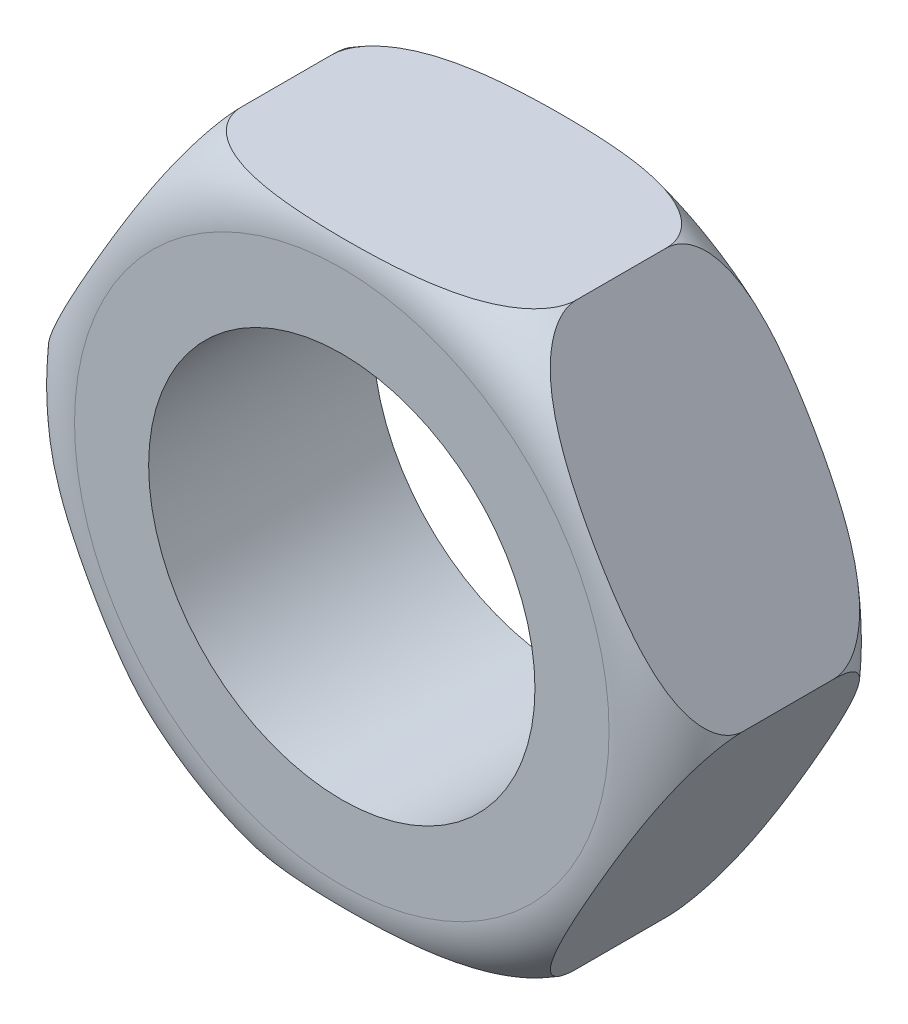
ISO-10303-21;
HEADER;
FILE_DESCRIPTION(('STEP AP214'),'2;1');
FILE_NAME('part.step','',(''),(''),'','','');
FILE_SCHEMA(('AUTOMOTIVE_DESIGN { 1 0 10303 214 1 1 1 1 }'));
ENDSEC;
DATA;
#1=APPLICATION_CONTEXT('core data for automotive mechanical design processes');
#2=APPLICATION_PROTOCOL_DEFINITION('international standard','automotive_design',2000,#1);
#3=PRODUCT_CONTEXT('',#1,'mechanical');
#4=PRODUCT('Part','Part','',(#3));
#5=PRODUCT_RELATED_PRODUCT_CATEGORY('part','',(#4));
#6=PRODUCT_DEFINITION_FORMATION('','',#4);
#7=PRODUCT_DEFINITION_CONTEXT('part definition',#1,'design');
#8=PRODUCT_DEFINITION('design','',#6,#7);
#9=PRODUCT_DEFINITION_SHAPE('','',#8);
#10=(LENGTH_UNIT() NAMED_UNIT(*) SI_UNIT(.MILLI.,.METRE.));
#11=(NAMED_UNIT(*) PLANE_ANGLE_UNIT() SI_UNIT($,.RADIAN.));
#12=(NAMED_UNIT(*) SI_UNIT($,.STERADIAN.) SOLID_ANGLE_UNIT());
#13=UNCERTAINTY_MEASURE_WITH_UNIT(LENGTH_MEASURE(1.E-05),#10,'distance_accuracy_value','');
#14=(GEOMETRIC_REPRESENTATION_CONTEXT(3) GLOBAL_UNCERTAINTY_ASSIGNED_CONTEXT((#13)) GLOBAL_UNIT_ASSIGNED_CONTEXT((#10,
#11,#12)) REPRESENTATION_CONTEXT('',''));
#15=CARTESIAN_POINT('',(0.,0.,0.));
#16=DIRECTION('',(0.,0.,1.));
#17=DIRECTION('',(1.,0.,0.));
#18=AXIS2_PLACEMENT_3D('',#15,#16,#17);
#19=CARTESIAN_POINT('',(-6.87407664253898,-11.90625,100.2393));
#20=DIRECTION('',(0.,1.,0.));
#21=DIRECTION('',(1.,0.,0.));
#22=AXIS2_PLACEMENT_3D('',#19,#20,#21);
#23=PLANE('',#22);
#24=DIRECTION('',(0.,0.,-1.));
#25=VECTOR('',#24,1.);
#26=CARTESIAN_POINT('',(6.874076642539,-11.90625,100.2393));
#27=LINE('',#26,#25);
#28=CARTESIAN_POINT('',(6.87407664253901,-11.90625,97.47324));
#29=VERTEX_POINT('',#28);
#30=CARTESIAN_POINT('',(6.874076642539,-11.90625,93.78516));
#31=VERTEX_POINT('',#30);
#32=EDGE_CURVE('E71',#29,#31,#27,.T.);
#33=ORIENTED_EDGE('',*,*,#32,.F.);
#34=CARTESIAN_POINT('',(6.87407664253902,-11.90625,97.47324));
#35=CARTESIAN_POINT('',(6.87407664253902,-11.90625,97.9620946136209));
#36=CARTESIAN_POINT('',(6.54380387878346,-11.90625,98.4063057244648));
#37=CARTESIAN_POINT('',(6.27092783934492,-11.90625,98.7733192414844));
#38=CARTESIAN_POINT('',(5.79655615993552,-11.90625,99.0677602948771));
#39=CARTESIAN_POINT('',(5.07488756466012,-11.90625,99.5156977890756));
#40=CARTESIAN_POINT('',(3.93169877939446,-11.90625,99.7597889167322));
#41=CARTESIAN_POINT('',(2.42435365360668,-11.90625,100.08163389655));
#42=CARTESIAN_POINT('',(-0.0182857169352697,-11.90625,100.080344972237));
#43=CARTESIAN_POINT('',(-2.45491865486506,-11.90625,100.079059217379));
#44=CARTESIAN_POINT('',(-3.95635400238736,-11.90625,99.7544919782639));
#45=CARTESIAN_POINT('',(-5.08601296263468,-11.90625,99.5102921261192));
#46=CARTESIAN_POINT('',(-5.80218815013209,-11.90625,99.0642586412282));
#47=CARTESIAN_POINT('',(-6.27164365043596,-11.90625,98.7718820321845));
#48=CARTESIAN_POINT('',(-6.54373366839595,-11.90625,98.4064000937005));
#49=CARTESIAN_POINT('',(-6.87407664253898,-11.90625,97.9626705094269));
#50=CARTESIAN_POINT('',(-6.87407664253898,-11.90625,97.47324));
#51=B_SPLINE_CURVE_WITH_KNOTS('',2,(#34,#35,#36,#37,#38,#39,#40,#41,#42,#43,#44,#45,#46,#47,#48,
#49,#50),.UNSPECIFIED.,.F.,.F.,(3,2,2,2,2,2,2,2,3),(0.,0.0625,0.125,0.25,0.5,0.75,0.875,0.9375,
1.),.UNSPECIFIED.);
#52=CARTESIAN_POINT('',(-6.87407664253898,-11.90625,97.47324));
#53=VERTEX_POINT('',#52);
#54=EDGE_CURVE('E231',#29,#53,#51,.T.);
#55=ORIENTED_EDGE('',*,*,#54,.T.);
#56=DIRECTION('',(0.,0.,-1.));
#57=VECTOR('',#56,1.);
#58=CARTESIAN_POINT('',(-6.87407664253898,-11.90625,100.2393));
#59=LINE('',#58,#57);
#60=CARTESIAN_POINT('',(-6.87407664253901,-11.90625,93.78516));
#61=VERTEX_POINT('',#60);
#62=EDGE_CURVE('E11',#53,#61,#59,.T.);
#63=ORIENTED_EDGE('',*,*,#62,.T.);
#64=CARTESIAN_POINT('',(-6.87407664253901,-11.90625,93.78516));
#65=CARTESIAN_POINT('',(-6.87407664253901,-11.90625,93.2963053863655));
#66=CARTESIAN_POINT('',(-6.54380387878346,-11.90625,92.8520942755352));
#67=CARTESIAN_POINT('',(-6.27092783935594,-11.90625,92.4850807585418));
#68=CARTESIAN_POINT('',(-5.79655615993552,-11.90625,92.1906397051228));
#69=CARTESIAN_POINT('',(-5.07488756465484,-11.90625,91.7427022108917));
#70=CARTESIAN_POINT('',(-3.93169877939448,-11.90625,91.4986110832678));
#71=CARTESIAN_POINT('',(-2.42435365355028,-11.90625,91.17676610348));
#72=CARTESIAN_POINT('',(0.0182857169351404,-11.90625,91.1780550277632));
#73=CARTESIAN_POINT('',(2.45491865470594,-11.90625,91.1793407825909));
#74=CARTESIAN_POINT('',(3.95635400238732,-11.90625,91.5039080217361));
#75=CARTESIAN_POINT('',(5.08601296265228,-11.90625,91.748107873881));
#76=CARTESIAN_POINT('',(5.80218815013206,-11.90625,92.1941413587717));
#77=CARTESIAN_POINT('',(6.27164365046108,-11.90625,92.4865179678382));
#78=CARTESIAN_POINT('',(6.54373366839594,-11.90625,92.8519999062995));
#79=CARTESIAN_POINT('',(6.874076642539,-11.90625,93.2957294905865));
#80=CARTESIAN_POINT('',(6.874076642539,-11.90625,93.78516));
#81=B_SPLINE_CURVE_WITH_KNOTS('',2,(#64,#65,#66,#67,#68,#69,#70,#71,#72,#73,#74,#75,#76,#77,#78,
#79,#80),.UNSPECIFIED.,.F.,.F.,(3,2,2,2,2,2,2,2,3),(0.,0.0625,0.125,0.25,0.5,0.75,0.875,0.9375,
1.),.UNSPECIFIED.);
#82=EDGE_CURVE('E261',#61,#31,#81,.T.);
#83=ORIENTED_EDGE('',*,*,#82,.T.);
#84=EDGE_LOOP('',(#33,#55,#63,#83));
#85=FACE_BOUND('',#84,.T.);
#86=ADVANCED_FACE('F17',(#85),#23,.F.);
#87=CARTESIAN_POINT('',(-13.748153285078,0.,100.2393));
#88=DIRECTION('',(0.866025403784439,0.5,0.));
#89=DIRECTION('',(0.,0.,-1.));
#90=AXIS2_PLACEMENT_3D('',#87,#88,#89);
#91=PLANE('',#90);
#92=ORIENTED_EDGE('',*,*,#62,.F.);
#93=CARTESIAN_POINT('',(-6.87407664253898,-11.90625,97.47324));
#94=CARTESIAN_POINT('',(-6.87407664253898,-11.90625,97.9621941519074));
#95=CARTESIAN_POINT('',(-7.03927004143693,-11.6201266400338,98.4064589908767));
#96=CARTESIAN_POINT('',(-7.17568813047196,-11.3838435787536,98.7733366068225));
#97=CARTESIAN_POINT('',(-7.41276338560254,-10.9732171916501,99.0676690818706));
#98=CARTESIAN_POINT('',(-7.77293234539041,-10.3493862539883,99.5148242322952));
#99=CARTESIAN_POINT('',(-8.34306670156636,-9.36188458195097,99.7588491117002));
#100=CARTESIAN_POINT('',(-9.09532815065278,-8.05892953155789,100.080826742772));
#101=CARTESIAN_POINT('',(-10.3146535980907,-5.9469959056338,100.080349204095));
#102=CARTESIAN_POINT('',(-11.5374262047154,-3.82909162485632,100.079870315367));
#103=CARTESIAN_POINT('',(-12.2902049825038,-2.52524053486718,99.7540969433487));
#104=CARTESIAN_POINT('',(-12.857275199875,-1.54304610692111,99.5086910122373));
#105=CARTESIAN_POINT('',(-13.2158049185761,-0.922054418107431,99.0597663843344));
#106=CARTESIAN_POINT('',(-13.4498057631181,-0.516753066346677,98.7667676827328));
#107=CARTESIAN_POINT('',(-13.5850275278136,-0.282542099605025,98.4008814105618));
#108=CARTESIAN_POINT('',(-13.748153285078,0.,97.9594918505679));
#109=CARTESIAN_POINT('',(-13.748153285078,0.,97.47324));
#110=B_SPLINE_CURVE_WITH_KNOTS('',2,(#93,#94,#95,#96,#97,#98,#99,#100,#101,#102,#103,#104,#105,
#106,#107,#108,#109),.UNSPECIFIED.,.F.,.F.,(3,2,2,2,2,2,2,2,3),(0.,0.0625,0.125,0.25,0.5,0.75,
0.875,0.9375,1.),.UNSPECIFIED.);
#111=CARTESIAN_POINT('',(-13.748153285078,0.,97.47324));
#112=VERTEX_POINT('',#111);
#113=EDGE_CURVE('E448',#53,#112,#110,.T.);
#114=ORIENTED_EDGE('',*,*,#113,.T.);
#115=DIRECTION('',(0.,0.,-1.));
#116=VECTOR('',#115,1.);
#117=CARTESIAN_POINT('',(-13.748153285078,0.,100.2393));
#118=LINE('',#117,#116);
#119=CARTESIAN_POINT('',(-13.748153285078,0.,93.78516));
#120=VERTEX_POINT('',#119);
#121=EDGE_CURVE('E30',#112,#120,#118,.T.);
#122=ORIENTED_EDGE('',*,*,#121,.T.);
#123=CARTESIAN_POINT('',(-13.748153285078,0.,93.78516));
#124=CARTESIAN_POINT('',(-13.748153285078,0.,93.2962058480812));
#125=CARTESIAN_POINT('',(-13.58295988618,-0.286123359966257,92.8519410091233));
#126=CARTESIAN_POINT('',(-13.4465417971419,-0.522406421251729,92.4850633931788));
#127=CARTESIAN_POINT('',(-13.2094665420144,-0.933032808349881,92.1907309181294));
#128=CARTESIAN_POINT('',(-12.8492975822611,-1.55686374595182,91.74357576774));
#129=CARTESIAN_POINT('',(-12.2791632260506,-2.54436541804904,91.4995508882998));
#130=CARTESIAN_POINT('',(-11.526901777027,-3.84732046833324,91.1775732572276));
#131=CARTESIAN_POINT('',(-10.3075763295263,-5.9592540943662,91.1780507959048));
#132=CARTESIAN_POINT('',(-9.08480372288455,-8.07715837517306,91.1785296846333));
#133=CARTESIAN_POINT('',(-8.33202494511309,-9.38100946513283,91.5043030566513));
#134=CARTESIAN_POINT('',(-7.76495472772195,-10.3632038931134,91.7497089877768));
#135=CARTESIAN_POINT('',(-7.40642500904078,-10.9841955818926,92.1986336156656));
#136=CARTESIAN_POINT('',(-7.17242416449604,-11.3894969336581,92.4916323172776));
#137=CARTESIAN_POINT('',(-7.03720239980334,-11.623707900395,92.8575185894381));
#138=CARTESIAN_POINT('',(-6.87407664253899,-11.90625,93.2989081494284));
#139=CARTESIAN_POINT('',(-6.87407664253899,-11.90625,93.78516));
#140=B_SPLINE_CURVE_WITH_KNOTS('',2,(#123,#124,#125,#126,#127,#128,#129,#130,#131,#132,#133,
#134,#135,#136,#137,#138,#139),.UNSPECIFIED.,.F.,.F.,(3,2,2,2,2,2,2,2,3),(0.,0.0625,0.125,0.25,
0.5,0.75,0.875,0.9375,1.),.UNSPECIFIED.);
#141=EDGE_CURVE('E146',#120,#61,#140,.T.);
#142=ORIENTED_EDGE('',*,*,#141,.T.);
#143=EDGE_LOOP('',(#92,#114,#122,#142));
#144=FACE_BOUND('',#143,.T.);
#145=ADVANCED_FACE('F246',(#144),#91,.F.);
#146=CARTESIAN_POINT('',(-6.87407664253898,11.90625,100.2393));
#147=DIRECTION('',(0.866025403784439,-0.5,0.));
#148=DIRECTION('',(0.,0.,-1.));
#149=AXIS2_PLACEMENT_3D('',#146,#147,#148);
#150=PLANE('',#149);
#151=ORIENTED_EDGE('',*,*,#121,.F.);
#152=CARTESIAN_POINT('',(-13.748153285078,0.,97.47324));
#153=CARTESIAN_POINT('',(-13.748153285078,0.,97.9621941518879));
#154=CARTESIAN_POINT('',(-13.58295988618,0.286123359966259,98.4064589908767));
#155=CARTESIAN_POINT('',(-13.4465417971598,0.522406421220787,98.7733366067988));
#156=CARTESIAN_POINT('',(-13.2094665420144,0.933032808349887,99.0676690818706));
#157=CARTESIAN_POINT('',(-12.8492975822179,1.55686374602659,99.514824232314));
#158=CARTESIAN_POINT('',(-12.2791632260506,2.54436541804903,99.7588491117002));
#159=CARTESIAN_POINT('',(-11.5269017769173,3.84732046852318,100.080826742772));
#160=CARTESIAN_POINT('',(-10.3075763295263,5.95925409436619,100.080349204095));
#161=CARTESIAN_POINT('',(-9.08480372303438,8.07715837491356,100.079870315367));
#162=CARTESIAN_POINT('',(-8.3320249451131,9.38100946513281,99.7540969433487));
#163=CARTESIAN_POINT('',(-7.76495472781884,10.3632038929456,99.5086910123139));
#164=CARTESIAN_POINT('',(-7.4064250090408,10.9841955818926,99.0597663843344));
#165=CARTESIAN_POINT('',(-7.17242416451528,11.3894969336248,98.7667676827664));
#166=CARTESIAN_POINT('',(-7.03720239980335,11.623707900395,98.4008814105619));
#167=CARTESIAN_POINT('',(-6.87407664253898,11.90625,97.9594918505812));
#168=CARTESIAN_POINT('',(-6.87407664253898,11.90625,97.47324));
#169=B_SPLINE_CURVE_WITH_KNOTS('',2,(#152,#153,#154,#155,#156,#157,#158,#159,#160,#161,#162,
#163,#164,#165,#166,#167,#168),.UNSPECIFIED.,.F.,.F.,(3,2,2,2,2,2,2,2,3),(0.,0.0625,0.125,0.25,
0.5,0.75,0.875,0.9375,1.),.UNSPECIFIED.);
#170=CARTESIAN_POINT('',(-6.87407664253898,11.90625,97.47324));
#171=VERTEX_POINT('',#170);
#172=EDGE_CURVE('E126',#112,#171,#169,.T.);
#173=ORIENTED_EDGE('',*,*,#172,.T.);
#174=DIRECTION('',(0.,0.,-1.));
#175=VECTOR('',#174,1.);
#176=CARTESIAN_POINT('',(-6.87407664253898,11.90625,100.2393));
#177=LINE('',#176,#175);
#178=CARTESIAN_POINT('',(-6.87407664253898,11.90625,93.78516));
#179=VERTEX_POINT('',#178);
#180=EDGE_CURVE('E119',#171,#179,#177,.T.);
#181=ORIENTED_EDGE('',*,*,#180,.T.);
#182=CARTESIAN_POINT('',(-6.87407664253898,11.90625,93.78516));
#183=CARTESIAN_POINT('',(-6.87407664253898,11.90625,93.2962058480913));
#184=CARTESIAN_POINT('',(-7.03927004143694,11.6201266400337,92.8519410091233));
#185=CARTESIAN_POINT('',(-7.17568813047506,11.3838435787483,92.4850633931704));
#186=CARTESIAN_POINT('',(-7.41276338560254,10.9732171916501,92.1907309181294));
#187=CARTESIAN_POINT('',(-7.77293234538418,10.3493862539991,91.7435757677175));
#188=CARTESIAN_POINT('',(-8.34306670156637,9.36188458195096,91.4995508882998));
#189=CARTESIAN_POINT('',(-9.09532815062178,8.05892953161159,91.1775732572276));
#190=CARTESIAN_POINT('',(-10.3146535980907,5.9469959056338,91.1780507959048));
#191=CARTESIAN_POINT('',(-11.5374262046148,3.82909162503062,91.1785296846332));
#192=CARTESIAN_POINT('',(-12.2902049825038,2.52524053486718,91.5043030566513));
#193=CARTESIAN_POINT('',(-12.8572751998333,1.54304610699341,91.7497089877118));
#194=CARTESIAN_POINT('',(-13.2158049185761,0.92205441810745,92.1986336156656));
#195=CARTESIAN_POINT('',(-13.4498057631135,0.51675306635468,92.4916323172605));
#196=CARTESIAN_POINT('',(-13.5850275278136,0.282542099605036,92.8575185894382));
#197=CARTESIAN_POINT('',(-13.748153285078,0.,93.2989081494251));
#198=CARTESIAN_POINT('',(-13.748153285078,0.,93.78516));
#199=B_SPLINE_CURVE_WITH_KNOTS('',2,(#182,#183,#184,#185,#186,#187,#188,#189,#190,#191,#192,
#193,#194,#195,#196,#197,#198),.UNSPECIFIED.,.F.,.F.,(3,2,2,2,2,2,2,2,3),(0.,0.0625,0.125,0.25,
0.5,0.75,0.875,0.9375,1.),.UNSPECIFIED.);
#200=EDGE_CURVE('E122',#179,#120,#199,.T.);
#201=ORIENTED_EDGE('',*,*,#200,.T.);
#202=EDGE_LOOP('',(#151,#173,#181,#201));
#203=FACE_BOUND('',#202,.T.);
#204=ADVANCED_FACE('F120',(#203),#150,.F.);
#205=CARTESIAN_POINT('',(6.87407664253897,11.90625,100.2393));
#206=DIRECTION('',(0.,-1.,0.));
#207=DIRECTION('',(0.,0.,-1.));
#208=AXIS2_PLACEMENT_3D('',#205,#206,#207);
#209=PLANE('',#208);
#210=ORIENTED_EDGE('',*,*,#180,.F.);
#211=CARTESIAN_POINT('',(-6.87407664253897,11.90625,97.47324));
#212=CARTESIAN_POINT('',(-6.87407664253897,11.90625,97.9620946136273));
#213=CARTESIAN_POINT('',(-6.54380387878343,11.90625,98.4063057244648));
#214=CARTESIAN_POINT('',(-6.27092783935533,11.90625,98.773319241465));
#215=CARTESIAN_POINT('',(-5.79655615993549,11.90625,99.0677602948772));
#216=CARTESIAN_POINT('',(-5.07488756459577,11.90625,99.5156977891352));
#217=CARTESIAN_POINT('',(-3.93169877939447,11.90625,99.7597889167322));
#218=CARTESIAN_POINT('',(-2.42435365332346,11.90625,100.08163389655));
#219=CARTESIAN_POINT('',(0.0182857169350997,11.90625,100.080344972237));
#220=CARTESIAN_POINT('',(2.45491865484432,11.90625,100.079059217379));
#221=CARTESIAN_POINT('',(3.95635400238726,11.90625,99.7544919782639));
#222=CARTESIAN_POINT('',(5.08601296257426,11.90625,99.5102921261357));
#223=CARTESIAN_POINT('',(5.80218815013202,11.90625,99.0642586412283));
#224=CARTESIAN_POINT('',(6.27164365041492,11.90625,98.7718820322115));
#225=CARTESIAN_POINT('',(6.54373366839591,11.90625,98.4064000937005));
#226=CARTESIAN_POINT('',(6.87407664253897,11.90625,97.9626705094284));
#227=CARTESIAN_POINT('',(6.87407664253897,11.90625,97.47324));
#228=B_SPLINE_CURVE_WITH_KNOTS('',2,(#211,#212,#213,#214,#215,#216,#217,#218,#219,#220,#221,
#222,#223,#224,#225,#226,#227),.UNSPECIFIED.,.F.,.F.,(3,2,2,2,2,2,2,2,3),(0.,0.0625,0.125,0.25,
0.5,0.75,0.875,0.9375,1.),.UNSPECIFIED.);
#229=CARTESIAN_POINT('',(6.87407664253898,11.90625,97.47324));
#230=VERTEX_POINT('',#229);
#231=EDGE_CURVE('E456',#171,#230,#228,.T.);
#232=ORIENTED_EDGE('',*,*,#231,.T.);
#233=DIRECTION('',(0.,0.,-1.));
#234=VECTOR('',#233,1.);
#235=CARTESIAN_POINT('',(6.87407664253897,11.90625,100.2393));
#236=LINE('',#235,#234);
#237=CARTESIAN_POINT('',(6.87407664253898,11.90625,93.78516));
#238=VERTEX_POINT('',#237);
#239=EDGE_CURVE('E87',#230,#238,#236,.T.);
#240=ORIENTED_EDGE('',*,*,#239,.T.);
#241=CARTESIAN_POINT('',(6.87407664253897,11.90625,93.78516));
#242=CARTESIAN_POINT('',(6.87407664253897,11.90625,93.2963053863638));
#243=CARTESIAN_POINT('',(6.54380387878343,11.90625,92.8520942755352));
#244=CARTESIAN_POINT('',(6.27092783934484,11.90625,92.4850807585282));
#245=CARTESIAN_POINT('',(5.79655615993549,11.90625,92.1906397051228));
#246=CARTESIAN_POINT('',(5.07488756462939,11.90625,91.7427022108861));
#247=CARTESIAN_POINT('',(3.93169877939447,11.90625,91.4986110832678));
#248=CARTESIAN_POINT('',(2.42435365327197,11.90625,91.1767661034208));
#249=CARTESIAN_POINT('',(-0.0182857169350806,11.90625,91.1780550277632));
#250=CARTESIAN_POINT('',(-2.45491865515727,11.90625,91.1793407826503));
#251=CARTESIAN_POINT('',(-3.95635400238725,11.90625,91.5039080217361));
#252=CARTESIAN_POINT('',(-5.08601296279365,11.90625,91.7481078739403));
#253=CARTESIAN_POINT('',(-5.80218815013203,11.90625,92.1941413587718));
#254=CARTESIAN_POINT('',(-6.27164365050111,11.90625,92.4865179678821));
#255=CARTESIAN_POINT('',(-6.54373366839593,11.90625,92.8519999062996));
#256=CARTESIAN_POINT('',(-6.87407664253897,11.90625,93.2957294905987));
#257=CARTESIAN_POINT('',(-6.87407664253897,11.90625,93.78516));
#258=B_SPLINE_CURVE_WITH_KNOTS('',2,(#241,#242,#243,#244,#245,#246,#247,#248,#249,#250,#251,
#252,#253,#254,#255,#256,#257),.UNSPECIFIED.,.F.,.F.,(3,2,2,2,2,2,2,2,3),(0.,0.0625,0.125,0.25,
0.5,0.75,0.875,0.9375,1.),.UNSPECIFIED.);
#259=EDGE_CURVE('E131',#238,#179,#258,.T.);
#260=ORIENTED_EDGE('',*,*,#259,.T.);
#261=EDGE_LOOP('',(#210,#232,#240,#260));
#262=FACE_BOUND('',#261,.T.);
#263=ADVANCED_FACE('F133',(#262),#209,.F.);
#264=CARTESIAN_POINT('',(13.748153285078,0.,100.2393));
#265=DIRECTION('',(-0.866025403784438,-0.5,0.));
#266=DIRECTION('',(-0.5,0.866025403784438,0.));
#267=AXIS2_PLACEMENT_3D('',#264,#265,#266);
#268=PLANE('',#267);
#269=ORIENTED_EDGE('',*,*,#239,.F.);
#270=CARTESIAN_POINT('',(6.87407664253897,11.90625,97.47324));
#271=CARTESIAN_POINT('',(6.87407664253897,11.90625,97.9621941518866));
#272=CARTESIAN_POINT('',(7.03927004143693,11.6201266400337,98.4064589908768));
#273=CARTESIAN_POINT('',(7.17568813044031,11.3838435788084,98.7733366067546));
#274=CARTESIAN_POINT('',(7.41276338560253,10.9732171916501,99.0676690818706));
#275=CARTESIAN_POINT('',(7.7729323453218,10.3493862541071,99.5148242322536));
#276=CARTESIAN_POINT('',(8.34306670156636,9.36188458195096,99.7588491117003));
#277=CARTESIAN_POINT('',(9.09532815068699,8.05892953149864,100.080826742803));
#278=CARTESIAN_POINT('',(10.3146535980907,5.94699590563381,100.080349204095));
#279=CARTESIAN_POINT('',(11.5374262048736,3.82909162458234,100.079870315336));
#280=CARTESIAN_POINT('',(12.2902049825038,2.52524053486719,99.7540969433486));
#281=CARTESIAN_POINT('',(12.8572751999134,1.5430461068547,99.5086910121924));
#282=CARTESIAN_POINT('',(13.2158049185761,0.922054418107446,99.0597663843344));
#283=CARTESIAN_POINT('',(13.4498057631256,0.516753066333823,98.7667676827215));
#284=CARTESIAN_POINT('',(13.5850275278136,0.282542099605034,98.4008814105618));
#285=CARTESIAN_POINT('',(13.748153285078,0.,97.9594918505573));
#286=CARTESIAN_POINT('',(13.748153285078,0.,97.47324));
#287=B_SPLINE_CURVE_WITH_KNOTS('',2,(#270,#271,#272,#273,#274,#275,#276,#277,#278,#279,#280,
#281,#282,#283,#284,#285,#286),.UNSPECIFIED.,.F.,.F.,(3,2,2,2,2,2,2,2,3),(0.,0.0625,0.125,0.25,
0.5,0.75,0.875,0.9375,1.),.UNSPECIFIED.);
#288=CARTESIAN_POINT('',(13.748153285078,0.,97.47324));
#289=VERTEX_POINT('',#288);
#290=EDGE_CURVE('E508',#230,#289,#287,.T.);
#291=ORIENTED_EDGE('',*,*,#290,.T.);
#292=DIRECTION('',(0.,0.,-1.));
#293=VECTOR('',#292,1.);
#294=CARTESIAN_POINT('',(13.748153285078,0.,100.2393));
#295=LINE('',#294,#293);
#296=CARTESIAN_POINT('',(13.748153285078,0.,93.78516));
#297=VERTEX_POINT('',#296);
#298=EDGE_CURVE('E198',#289,#297,#295,.T.);
#299=ORIENTED_EDGE('',*,*,#298,.T.);
#300=CARTESIAN_POINT('',(13.748153285078,0.,93.78516));
#301=CARTESIAN_POINT('',(13.748153285078,0.,93.2962058481039));
#302=CARTESIAN_POINT('',(13.58295988618,0.286123359966267,92.8519410091233));
#303=CARTESIAN_POINT('',(13.4465417971601,0.52240642122011,92.4850633932091));
#304=CARTESIAN_POINT('',(13.2094665420144,0.933032808349892,92.1907309181294));
#305=CARTESIAN_POINT('',(12.8492975822997,1.55686374588506,91.7435757677763));
#306=CARTESIAN_POINT('',(12.2791632260506,2.54436541804905,91.4995508882997));
#307=CARTESIAN_POINT('',(11.5269017770881,3.84732046822743,91.1775732572276));
#308=CARTESIAN_POINT('',(10.3075763295263,5.9592540943662,91.1780507959048));
#309=CARTESIAN_POINT('',(9.08480372282513,8.07715837527598,91.1785296846333));
#310=CARTESIAN_POINT('',(8.33202494511309,9.38100946513282,91.5043030566514));
#311=CARTESIAN_POINT('',(7.76495472769908,10.363203893153,91.7497089878061));
#312=CARTESIAN_POINT('',(7.40642500904078,10.9841955818926,92.1986336156656));
#313=CARTESIAN_POINT('',(7.17242416449032,11.389496933668,92.4916323172844));
#314=CARTESIAN_POINT('',(7.03720239980334,11.623707900395,92.8575185894382));
#315=CARTESIAN_POINT('',(6.87407664253897,11.90625,93.298908149439));
#316=CARTESIAN_POINT('',(6.87407664253897,11.90625,93.78516));
#317=B_SPLINE_CURVE_WITH_KNOTS('',2,(#300,#301,#302,#303,#304,#305,#306,#307,#308,#309,#310,
#311,#312,#313,#314,#315,#316),.UNSPECIFIED.,.F.,.F.,(3,2,2,2,2,2,2,2,3),(0.,0.0625,0.125,0.25,
0.5,0.75,0.875,0.9375,1.),.UNSPECIFIED.);
#318=EDGE_CURVE('E210',#297,#238,#317,.T.);
#319=ORIENTED_EDGE('',*,*,#318,.T.);
#320=EDGE_LOOP('',(#269,#291,#299,#319));
#321=FACE_BOUND('',#320,.T.);
#322=ADVANCED_FACE('F19',(#321),#268,.F.);
#323=CARTESIAN_POINT('',(6.874076642539,-11.90625,100.2393));
#324=DIRECTION('',(-0.866025403784439,0.5,0.));
#325=DIRECTION('',(0.,0.,1.));
#326=AXIS2_PLACEMENT_3D('',#323,#324,#325);
#327=PLANE('',#326);
#328=ORIENTED_EDGE('',*,*,#298,.F.);
#329=CARTESIAN_POINT('',(13.748153285078,0.,97.47324));
#330=CARTESIAN_POINT('',(13.748153285078,0.,97.9621941519016));
#331=CARTESIAN_POINT('',(13.58295988618,-0.286123359966277,98.4064589908767));
#332=CARTESIAN_POINT('',(13.4465417971601,-0.522406421220284,98.7733366067866));
#333=CARTESIAN_POINT('',(13.2094665420144,-0.933032808349905,99.0676690818706));
#334=CARTESIAN_POINT('',(12.8492975823102,-1.55686374586677,99.5148242322174));
#335=CARTESIAN_POINT('',(12.2791632260506,-2.54436541804906,99.7588491117003));
#336=CARTESIAN_POINT('',(11.5269017770935,-3.84732046821815,100.080826742772));
#337=CARTESIAN_POINT('',(10.3075763295263,-5.9592540943662,100.080349204095));
#338=CARTESIAN_POINT('',(9.08480372291193,-8.07715837512568,100.079870315367));
#339=CARTESIAN_POINT('',(8.33202494511312,-9.38100946513283,99.7540969433487));
#340=CARTESIAN_POINT('',(7.76495472773817,-10.3632038930854,99.5086910122391));
#341=CARTESIAN_POINT('',(7.40642500904081,-10.9841955818926,99.0597663843344));
#342=CARTESIAN_POINT('',(7.17242416450271,-11.3894969336466,98.7667676827335));
#343=CARTESIAN_POINT('',(7.03720239980336,-11.623707900395,98.4008814105619));
#344=CARTESIAN_POINT('',(6.874076642539,-11.90625,97.9594918505798));
#345=CARTESIAN_POINT('',(6.874076642539,-11.90625,97.47324));
#346=B_SPLINE_CURVE_WITH_KNOTS('',2,(#329,#330,#331,#332,#333,#334,#335,#336,#337,#338,#339,
#340,#341,#342,#343,#344,#345),.UNSPECIFIED.,.F.,.F.,(3,2,2,2,2,2,2,2,3),(0.,0.0625,0.125,0.25,
0.5,0.75,0.875,0.9375,1.),.UNSPECIFIED.);
#347=EDGE_CURVE('E499',#289,#29,#346,.T.);
#348=ORIENTED_EDGE('',*,*,#347,.T.);
#349=ORIENTED_EDGE('',*,*,#32,.T.);
#350=CARTESIAN_POINT('',(6.874076642539,-11.90625,93.78516));
#351=CARTESIAN_POINT('',(6.874076642539,-11.90625,93.2962058481024));
#352=CARTESIAN_POINT('',(7.03927004143696,-11.6201266400337,92.8519410091233));
#353=CARTESIAN_POINT('',(7.17568813045425,-11.3838435787843,92.4850633932172));
#354=CARTESIAN_POINT('',(7.41276338560256,-10.9732171916501,92.1907309181294));
#355=CARTESIAN_POINT('',(7.77293234529007,-10.3493862541621,91.7435757678024));
#356=CARTESIAN_POINT('',(8.34306670156638,-9.36188458195096,91.4995508882997));
#357=CARTESIAN_POINT('',(9.09532815048425,-8.05892953184985,91.1775732572276));
#358=CARTESIAN_POINT('',(10.3146535980907,-5.94699590563382,91.1780507959048));
#359=CARTESIAN_POINT('',(11.537426204793,-3.82909162472194,91.1785296846333));
#360=CARTESIAN_POINT('',(12.2902049825038,-2.5252405348672,91.5043030566514));
#361=CARTESIAN_POINT('',(12.8572751999163,-1.5430461068497,91.7497089878058));
#362=CARTESIAN_POINT('',(13.2158049185762,-0.922054418107467,92.1986336156656));
#363=CARTESIAN_POINT('',(13.4498057631259,-0.516753066333359,92.4916323172823));
#364=CARTESIAN_POINT('',(13.5850275278136,-0.282542099605054,92.8575185894382));
#365=CARTESIAN_POINT('',(13.748153285078,0.,93.298908149439));
#366=CARTESIAN_POINT('',(13.748153285078,0.,93.78516));
#367=B_SPLINE_CURVE_WITH_KNOTS('',2,(#350,#351,#352,#353,#354,#355,#356,#357,#358,#359,#360,
#361,#362,#363,#364,#365,#366),.UNSPECIFIED.,.F.,.F.,(3,2,2,2,2,2,2,2,3),(0.,0.0625,0.125,0.25,
0.5,0.75,0.875,0.9375,1.),.UNSPECIFIED.);
#368=EDGE_CURVE('E262',#31,#297,#367,.T.);
#369=ORIENTED_EDGE('',*,*,#368,.T.);
#370=EDGE_LOOP('',(#328,#348,#349,#369));
#371=FACE_BOUND('',#370,.T.);
#372=ADVANCED_FACE('F374',(#371),#327,.F.);
#373=CARTESIAN_POINT('',(13.748153285078,0.,91.0191));
#374=DIRECTION('',(0.,0.,1.));
#375=DIRECTION('',(1.,0.,0.));
#376=AXIS2_PLACEMENT_3D('',#373,#374,#375);
#377=PLANE('',#376);
#378=CARTESIAN_POINT('',(0.,0.,91.0191));
#379=DIRECTION('',(0.,0.,1.));
#380=DIRECTION('',(1.,0.,0.));
#381=AXIS2_PLACEMENT_3D('',#378,#379,#380);
#382=CIRCLE('',#381,7.9375);
#383=CARTESIAN_POINT('',(-7.9375,0.,91.0191));
#384=VERTEX_POINT('',#383);
#385=EDGE_CURVE('E43',#384,#384,#382,.T.);
#386=ORIENTED_EDGE('',*,*,#385,.T.);
#387=EDGE_LOOP('',(#386));
#388=FACE_BOUND('',#387,.T.);
#389=CARTESIAN_POINT('',(0.,0.,91.0191));
#390=DIRECTION('',(0.,0.,1.));
#391=DIRECTION('',(1.,0.,0.));
#392=AXIS2_PLACEMENT_3D('',#389,#390,#391);
#393=CIRCLE('',#392,10.982093285078);
#394=CARTESIAN_POINT('',(-10.982093285078,0.,91.0191));
#395=VERTEX_POINT('',#394);
#396=EDGE_CURVE('E273',#395,#395,#393,.T.);
#397=ORIENTED_EDGE('',*,*,#396,.F.);
#398=EDGE_LOOP('',(#397));
#399=FACE_BOUND('',#398,.T.);
#400=ADVANCED_FACE('F171',(#388,#399),#377,.F.);
#401=CARTESIAN_POINT('',(13.748153285078,0.,100.2393));
#402=DIRECTION('',(0.,0.,1.));
#403=DIRECTION('',(1.,0.,0.));
#404=AXIS2_PLACEMENT_3D('',#401,#402,#403);
#405=PLANE('',#404);
#406=CARTESIAN_POINT('',(0.,0.,100.2393));
#407=DIRECTION('',(0.,0.,1.));
#408=DIRECTION('',(1.,0.,0.));
#409=AXIS2_PLACEMENT_3D('',#406,#407,#408);
#410=CIRCLE('',#409,7.9375);
#411=CARTESIAN_POINT('',(7.9375,0.,100.2393));
#412=VERTEX_POINT('',#411);
#413=EDGE_CURVE('E139',#412,#412,#410,.T.);
#414=ORIENTED_EDGE('',*,*,#413,.F.);
#415=EDGE_LOOP('',(#414));
#416=FACE_BOUND('',#415,.T.);
#417=CARTESIAN_POINT('',(0.,0.,100.2393));
#418=DIRECTION('',(0.,0.,1.));
#419=DIRECTION('',(1.,0.,0.));
#420=AXIS2_PLACEMENT_3D('',#417,#418,#419);
#421=CIRCLE('',#420,10.982093285078);
#422=CARTESIAN_POINT('',(10.982093285078,0.,100.2393));
#423=VERTEX_POINT('',#422);
#424=EDGE_CURVE('E278',#423,#423,#421,.T.);
#425=ORIENTED_EDGE('',*,*,#424,.T.);
#426=EDGE_LOOP('',(#425));
#427=FACE_BOUND('',#426,.T.);
#428=ADVANCED_FACE('F303',(#416,#427),#405,.T.);
#429=CARTESIAN_POINT('',(0.,0.,100.2393));
#430=DIRECTION('',(0.,0.,-1.));
#431=DIRECTION('',(-1.,0.,0.));
#432=AXIS2_PLACEMENT_3D('',#429,#430,#431);
#433=CYLINDRICAL_SURFACE('',#432,7.9375);
#434=ORIENTED_EDGE('',*,*,#385,.F.);
#435=EDGE_LOOP('',(#434));
#436=FACE_BOUND('',#435,.T.);
#437=ORIENTED_EDGE('',*,*,#413,.T.);
#438=EDGE_LOOP('',(#437));
#439=FACE_BOUND('',#438,.T.);
#440=ADVANCED_FACE('F169',(#436,#439),#433,.F.);
#441=CARTESIAN_POINT('',(0.,0.,93.78516));
#442=DIRECTION('',(0.,0.,1.));
#443=DIRECTION('',(1.,0.,0.));
#444=AXIS2_PLACEMENT_3D('',#441,#442,#443);
#445=TOROIDAL_SURFACE('',#444,10.982093285078,2.76606);
#446=ORIENTED_EDGE('',*,*,#318,.F.);
#447=ORIENTED_EDGE('',*,*,#368,.F.);
#448=ORIENTED_EDGE('',*,*,#82,.F.);
#449=ORIENTED_EDGE('',*,*,#141,.F.);
#450=ORIENTED_EDGE('',*,*,#200,.F.);
#451=ORIENTED_EDGE('',*,*,#259,.F.);
#452=EDGE_LOOP('',(#446,#447,#448,#449,#450,#451));
#453=FACE_BOUND('',#452,.T.);
#454=ORIENTED_EDGE('',*,*,#396,.T.);
#455=EDGE_LOOP('',(#454));
#456=FACE_BOUND('',#455,.T.);
#457=ADVANCED_FACE('F143',(#453,#456),#445,.T.);
#458=CARTESIAN_POINT('',(0.,0.,97.47324));
#459=DIRECTION('',(0.,0.,1.));
#460=DIRECTION('',(1.,0.,0.));
#461=AXIS2_PLACEMENT_3D('',#458,#459,#460);
#462=TOROIDAL_SURFACE('',#461,10.982093285078,2.76606);
#463=ORIENTED_EDGE('',*,*,#424,.F.);
#464=EDGE_LOOP('',(#463));
#465=FACE_BOUND('',#464,.T.);
#466=ORIENTED_EDGE('',*,*,#347,.F.);
#467=ORIENTED_EDGE('',*,*,#290,.F.);
#468=ORIENTED_EDGE('',*,*,#231,.F.);
#469=ORIENTED_EDGE('',*,*,#172,.F.);
#470=ORIENTED_EDGE('',*,*,#113,.F.);
#471=ORIENTED_EDGE('',*,*,#54,.F.);
#472=EDGE_LOOP('',(#466,#467,#468,#469,#470,#471));
#473=FACE_BOUND('',#472,.T.);
#474=ADVANCED_FACE('F168',(#465,#473),#462,.T.);
#475=CLOSED_SHELL('',(#86,#145,#204,#263,#322,#372,#400,#428,#440,#457,#474));
#476=MANIFOLD_SOLID_BREP('B1',#475);
#477=ADVANCED_BREP_SHAPE_REPRESENTATION('',(#18,#476),#14);
#478=SHAPE_DEFINITION_REPRESENTATION(#9,#477);
ENDSEC;
END-ISO-10303-21;
